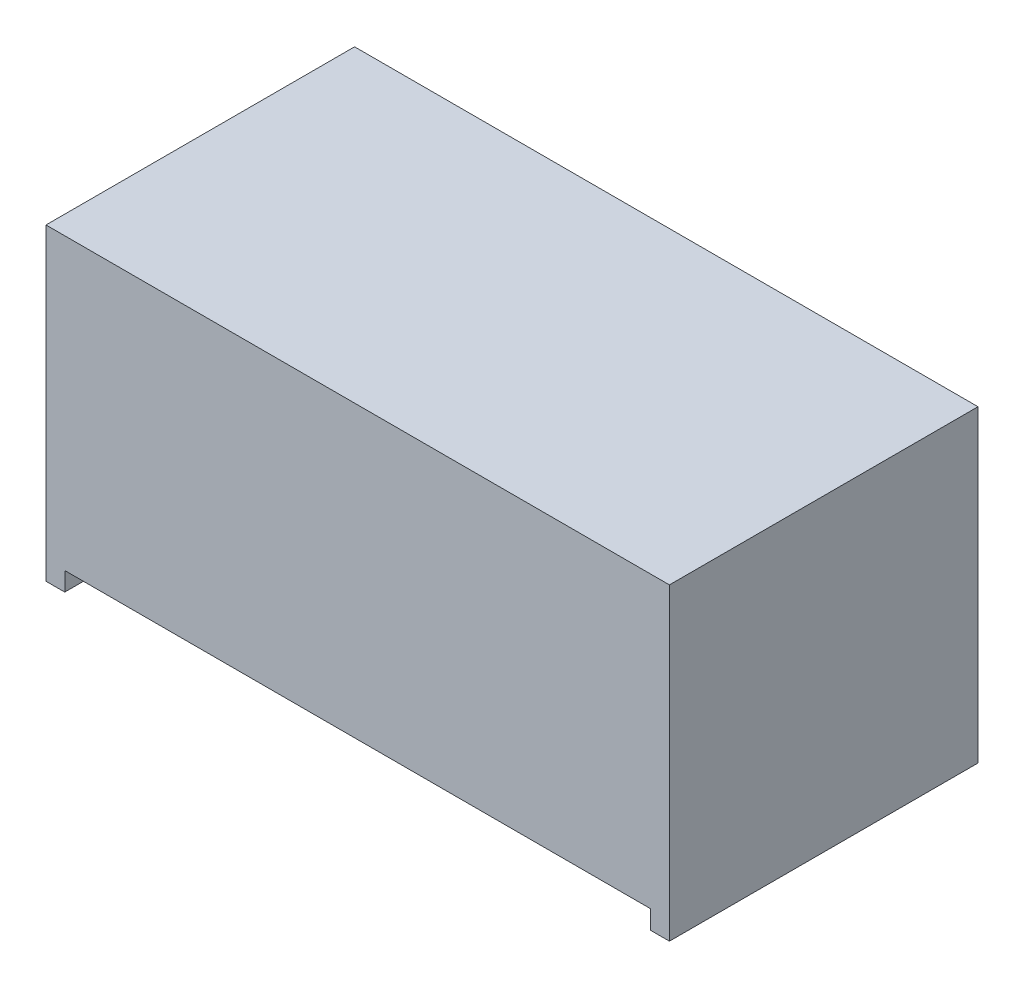
ISO-10303-21;
HEADER;
FILE_DESCRIPTION(('STEP AP214'),'2;1');
FILE_NAME('part.step','',(''),(''),'','','');
FILE_SCHEMA(('AUTOMOTIVE_DESIGN { 1 0 10303 214 1 1 1 1 }'));
ENDSEC;
DATA;
#1=APPLICATION_CONTEXT('core data for automotive mechanical design processes');
#2=APPLICATION_PROTOCOL_DEFINITION('international standard','automotive_design',2000,#1);
#3=PRODUCT_CONTEXT('',#1,'mechanical');
#4=PRODUCT('Part','Part','',(#3));
#5=PRODUCT_RELATED_PRODUCT_CATEGORY('part','',(#4));
#6=PRODUCT_DEFINITION_FORMATION('','',#4);
#7=PRODUCT_DEFINITION_CONTEXT('part definition',#1,'design');
#8=PRODUCT_DEFINITION('design','',#6,#7);
#9=PRODUCT_DEFINITION_SHAPE('','',#8);
#10=(LENGTH_UNIT() NAMED_UNIT(*) SI_UNIT(.MILLI.,.METRE.));
#11=(NAMED_UNIT(*) PLANE_ANGLE_UNIT() SI_UNIT($,.RADIAN.));
#12=(NAMED_UNIT(*) SI_UNIT($,.STERADIAN.) SOLID_ANGLE_UNIT());
#13=UNCERTAINTY_MEASURE_WITH_UNIT(LENGTH_MEASURE(1.E-05),#10,'distance_accuracy_value','');
#14=(GEOMETRIC_REPRESENTATION_CONTEXT(3) GLOBAL_UNCERTAINTY_ASSIGNED_CONTEXT((#13)) GLOBAL_UNIT_ASSIGNED_CONTEXT((#10,
#11,#12)) REPRESENTATION_CONTEXT('',''));
#15=CARTESIAN_POINT('',(0.,0.,0.));
#16=DIRECTION('',(0.,0.,1.));
#17=DIRECTION('',(1.,0.,0.));
#18=AXIS2_PLACEMENT_3D('',#15,#16,#17);
#19=CARTESIAN_POINT('',(10.,0.,4.95));
#20=DIRECTION('',(0.,1.,0.));
#21=DIRECTION('',(0.,0.,1.));
#22=AXIS2_PLACEMENT_3D('',#19,#20,#21);
#23=PLANE('',#22);
#24=DIRECTION('',(0.,0.,-1.));
#25=VECTOR('',#24,1.);
#26=CARTESIAN_POINT('',(9.39831035914173,0.,4.95));
#27=LINE('',#26,#25);
#28=CARTESIAN_POINT('',(9.39831035914173,0.,4.95));
#29=VERTEX_POINT('',#28);
#30=CARTESIAN_POINT('',(9.39831035914173,0.,-4.95));
#31=VERTEX_POINT('',#30);
#32=EDGE_CURVE('E121',#29,#31,#27,.T.);
#33=ORIENTED_EDGE('',*,*,#32,.F.);
#34=DIRECTION('',(1.,0.,0.));
#35=VECTOR('',#34,1.);
#36=CARTESIAN_POINT('',(-10.,0.,4.95));
#37=LINE('',#36,#35);
#38=CARTESIAN_POINT('',(-9.39831035914173,0.,4.95));
#39=VERTEX_POINT('',#38);
#40=EDGE_CURVE('E149',#39,#29,#37,.T.);
#41=ORIENTED_EDGE('',*,*,#40,.F.);
#42=DIRECTION('',(0.,0.,1.));
#43=VECTOR('',#42,1.);
#44=CARTESIAN_POINT('',(-9.39831035914173,0.,4.95));
#45=LINE('',#44,#43);
#46=CARTESIAN_POINT('',(-9.39831035914173,0.,-4.95));
#47=VERTEX_POINT('',#46);
#48=EDGE_CURVE('E130',#47,#39,#45,.T.);
#49=ORIENTED_EDGE('',*,*,#48,.F.);
#50=DIRECTION('',(-1.,0.,0.));
#51=VECTOR('',#50,1.);
#52=CARTESIAN_POINT('',(-10.,0.,-4.95));
#53=LINE('',#52,#51);
#54=EDGE_CURVE('E34',#31,#47,#53,.T.);
#55=ORIENTED_EDGE('',*,*,#54,.F.);
#56=EDGE_LOOP('',(#33,#41,#49,#55));
#57=FACE_BOUND('',#56,.T.);
#58=ADVANCED_FACE('F30',(#57),#23,.F.);
#59=CARTESIAN_POINT('',(10.,9.3,-4.95));
#60=DIRECTION('',(-1.,0.,0.));
#61=DIRECTION('',(0.,0.,1.));
#62=AXIS2_PLACEMENT_3D('',#59,#60,#61);
#63=PLANE('',#62);
#64=DIRECTION('',(0.,-1.,0.));
#65=VECTOR('',#64,1.);
#66=CARTESIAN_POINT('',(10.,9.3,4.95));
#67=LINE('',#66,#65);
#68=CARTESIAN_POINT('',(10.,9.3,4.95));
#69=VERTEX_POINT('',#68);
#70=CARTESIAN_POINT('',(10.,-0.6,4.95));
#71=VERTEX_POINT('',#70);
#72=EDGE_CURVE('E99',#69,#71,#67,.T.);
#73=ORIENTED_EDGE('',*,*,#72,.T.);
#74=DIRECTION('',(0.,0.,1.));
#75=VECTOR('',#74,1.);
#76=CARTESIAN_POINT('',(10.,-0.6,4.95));
#77=LINE('',#76,#75);
#78=CARTESIAN_POINT('',(10.,-0.6,-4.95));
#79=VERTEX_POINT('',#78);
#80=EDGE_CURVE('E103',#79,#71,#77,.T.);
#81=ORIENTED_EDGE('',*,*,#80,.F.);
#82=DIRECTION('',(0.,-1.,0.));
#83=VECTOR('',#82,1.);
#84=CARTESIAN_POINT('',(10.,9.3,-4.95));
#85=LINE('',#84,#83);
#86=CARTESIAN_POINT('',(10.,9.3,-4.95));
#87=VERTEX_POINT('',#86);
#88=EDGE_CURVE('E11',#87,#79,#85,.T.);
#89=ORIENTED_EDGE('',*,*,#88,.F.);
#90=DIRECTION('',(0.,0.,-1.));
#91=VECTOR('',#90,1.);
#92=CARTESIAN_POINT('',(10.,9.3,-4.95));
#93=LINE('',#92,#91);
#94=EDGE_CURVE('E104',#69,#87,#93,.T.);
#95=ORIENTED_EDGE('',*,*,#94,.F.);
#96=EDGE_LOOP('',(#73,#81,#89,#95));
#97=FACE_BOUND('',#96,.T.);
#98=ADVANCED_FACE('F32',(#97),#63,.F.);
#99=CARTESIAN_POINT('',(-10.,9.3,-4.95));
#100=DIRECTION('',(0.,0.,1.));
#101=DIRECTION('',(1.,0.,0.));
#102=AXIS2_PLACEMENT_3D('',#99,#100,#101);
#103=PLANE('',#102);
#104=ORIENTED_EDGE('',*,*,#88,.T.);
#105=DIRECTION('',(1.,0.,0.));
#106=VECTOR('',#105,1.);
#107=CARTESIAN_POINT('',(10.,-0.6,-4.95));
#108=LINE('',#107,#106);
#109=CARTESIAN_POINT('',(9.39831035914173,-0.6,-4.95));
#110=VERTEX_POINT('',#109);
#111=EDGE_CURVE('E120',#110,#79,#108,.T.);
#112=ORIENTED_EDGE('',*,*,#111,.F.);
#113=DIRECTION('',(0.,1.,0.));
#114=VECTOR('',#113,1.);
#115=CARTESIAN_POINT('',(9.39831035914173,-0.6,-4.95));
#116=LINE('',#115,#114);
#117=EDGE_CURVE('E126',#110,#31,#116,.T.);
#118=ORIENTED_EDGE('',*,*,#117,.T.);
#119=ORIENTED_EDGE('',*,*,#54,.T.);
#120=DIRECTION('',(0.,1.,0.));
#121=VECTOR('',#120,1.);
#122=CARTESIAN_POINT('',(-9.39831035914173,-0.6,-4.95));
#123=LINE('',#122,#121);
#124=CARTESIAN_POINT('',(-9.39831035914173,-0.6,-4.95));
#125=VERTEX_POINT('',#124);
#126=EDGE_CURVE('E153',#125,#47,#123,.T.);
#127=ORIENTED_EDGE('',*,*,#126,.F.);
#128=DIRECTION('',(1.,0.,0.));
#129=VECTOR('',#128,1.);
#130=CARTESIAN_POINT('',(-10.,-0.6,-4.95));
#131=LINE('',#130,#129);
#132=CARTESIAN_POINT('',(-10.,-0.6,-4.95));
#133=VERTEX_POINT('',#132);
#134=EDGE_CURVE('E134',#133,#125,#131,.T.);
#135=ORIENTED_EDGE('',*,*,#134,.F.);
#136=DIRECTION('',(0.,-1.,0.));
#137=VECTOR('',#136,1.);
#138=CARTESIAN_POINT('',(-10.,9.3,-4.95));
#139=LINE('',#138,#137);
#140=CARTESIAN_POINT('',(-10.,9.3,-4.95));
#141=VERTEX_POINT('',#140);
#142=EDGE_CURVE('E40',#141,#133,#139,.T.);
#143=ORIENTED_EDGE('',*,*,#142,.F.);
#144=DIRECTION('',(-1.,0.,0.));
#145=VECTOR('',#144,1.);
#146=CARTESIAN_POINT('',(-10.,9.3,-4.95));
#147=LINE('',#146,#145);
#148=EDGE_CURVE('E160',#87,#141,#147,.T.);
#149=ORIENTED_EDGE('',*,*,#148,.F.);
#150=EDGE_LOOP('',(#104,#112,#118,#119,#127,#135,#143,#149));
#151=FACE_BOUND('',#150,.T.);
#152=ADVANCED_FACE('F175',(#151),#103,.F.);
#153=CARTESIAN_POINT('',(-10.,9.3,-4.95));
#154=DIRECTION('',(1.,0.,0.));
#155=DIRECTION('',(0.,0.,-1.));
#156=AXIS2_PLACEMENT_3D('',#153,#154,#155);
#157=PLANE('',#156);
#158=ORIENTED_EDGE('',*,*,#142,.T.);
#159=DIRECTION('',(0.,0.,-1.));
#160=VECTOR('',#159,1.);
#161=CARTESIAN_POINT('',(-10.,-0.6,4.95));
#162=LINE('',#161,#160);
#163=CARTESIAN_POINT('',(-10.,-0.6,4.95));
#164=VERTEX_POINT('',#163);
#165=EDGE_CURVE('E131',#164,#133,#162,.T.);
#166=ORIENTED_EDGE('',*,*,#165,.F.);
#167=DIRECTION('',(0.,-1.,0.));
#168=VECTOR('',#167,1.);
#169=CARTESIAN_POINT('',(-10.,9.3,4.95));
#170=LINE('',#169,#168);
#171=CARTESIAN_POINT('',(-10.,9.3,4.95));
#172=VERTEX_POINT('',#171);
#173=EDGE_CURVE('E106',#172,#164,#170,.T.);
#174=ORIENTED_EDGE('',*,*,#173,.F.);
#175=DIRECTION('',(0.,0.,1.));
#176=VECTOR('',#175,1.);
#177=CARTESIAN_POINT('',(-10.,9.3,-4.95));
#178=LINE('',#177,#176);
#179=EDGE_CURVE('E161',#141,#172,#178,.T.);
#180=ORIENTED_EDGE('',*,*,#179,.F.);
#181=EDGE_LOOP('',(#158,#166,#174,#180));
#182=FACE_BOUND('',#181,.T.);
#183=ADVANCED_FACE('F173',(#182),#157,.F.);
#184=CARTESIAN_POINT('',(-10.,9.3,4.95));
#185=DIRECTION('',(0.,0.,-1.));
#186=DIRECTION('',(-1.,0.,0.));
#187=AXIS2_PLACEMENT_3D('',#184,#185,#186);
#188=PLANE('',#187);
#189=ORIENTED_EDGE('',*,*,#173,.T.);
#190=DIRECTION('',(-1.,0.,0.));
#191=VECTOR('',#190,1.);
#192=CARTESIAN_POINT('',(-10.,-0.6,4.95));
#193=LINE('',#192,#191);
#194=CARTESIAN_POINT('',(-9.39831035914173,-0.6,4.95));
#195=VERTEX_POINT('',#194);
#196=EDGE_CURVE('E138',#195,#164,#193,.T.);
#197=ORIENTED_EDGE('',*,*,#196,.F.);
#198=DIRECTION('',(0.,1.,0.));
#199=VECTOR('',#198,1.);
#200=CARTESIAN_POINT('',(-9.39831035914173,-0.6,4.95));
#201=LINE('',#200,#199);
#202=EDGE_CURVE('E141',#195,#39,#201,.T.);
#203=ORIENTED_EDGE('',*,*,#202,.T.);
#204=ORIENTED_EDGE('',*,*,#40,.T.);
#205=DIRECTION('',(0.,1.,0.));
#206=VECTOR('',#205,1.);
#207=CARTESIAN_POINT('',(9.39831035914173,-0.6,4.95));
#208=LINE('',#207,#206);
#209=CARTESIAN_POINT('',(9.39831035914173,-0.6,4.95));
#210=VERTEX_POINT('',#209);
#211=EDGE_CURVE('E112',#210,#29,#208,.T.);
#212=ORIENTED_EDGE('',*,*,#211,.F.);
#213=DIRECTION('',(-1.,0.,0.));
#214=VECTOR('',#213,1.);
#215=CARTESIAN_POINT('',(10.,-0.6,4.95));
#216=LINE('',#215,#214);
#217=EDGE_CURVE('E109',#71,#210,#216,.T.);
#218=ORIENTED_EDGE('',*,*,#217,.F.);
#219=ORIENTED_EDGE('',*,*,#72,.F.);
#220=DIRECTION('',(1.,0.,0.));
#221=VECTOR('',#220,1.);
#222=CARTESIAN_POINT('',(-10.,9.3,4.95));
#223=LINE('',#222,#221);
#224=EDGE_CURVE('E55',#172,#69,#223,.T.);
#225=ORIENTED_EDGE('',*,*,#224,.F.);
#226=EDGE_LOOP('',(#189,#197,#203,#204,#212,#218,#219,#225));
#227=FACE_BOUND('',#226,.T.);
#228=ADVANCED_FACE('F110',(#227),#188,.F.);
#229=CARTESIAN_POINT('',(10.,9.3,4.95));
#230=DIRECTION('',(0.,1.,0.));
#231=DIRECTION('',(0.,0.,1.));
#232=AXIS2_PLACEMENT_3D('',#229,#230,#231);
#233=PLANE('',#232);
#234=ORIENTED_EDGE('',*,*,#94,.T.);
#235=ORIENTED_EDGE('',*,*,#148,.T.);
#236=ORIENTED_EDGE('',*,*,#179,.T.);
#237=ORIENTED_EDGE('',*,*,#224,.T.);
#238=EDGE_LOOP('',(#234,#235,#236,#237));
#239=FACE_BOUND('',#238,.T.);
#240=ADVANCED_FACE('F201',(#239),#233,.T.);
#241=CARTESIAN_POINT('',(-9.39831035914173,-0.6,4.95));
#242=DIRECTION('',(-1.,0.,0.));
#243=DIRECTION('',(0.,0.,1.));
#244=AXIS2_PLACEMENT_3D('',#241,#242,#243);
#245=PLANE('',#244);
#246=ORIENTED_EDGE('',*,*,#48,.T.);
#247=ORIENTED_EDGE('',*,*,#202,.F.);
#248=DIRECTION('',(0.,0.,1.));
#249=VECTOR('',#248,1.);
#250=CARTESIAN_POINT('',(-9.39831035914173,-0.6,4.95));
#251=LINE('',#250,#249);
#252=EDGE_CURVE('E136',#125,#195,#251,.T.);
#253=ORIENTED_EDGE('',*,*,#252,.F.);
#254=ORIENTED_EDGE('',*,*,#126,.T.);
#255=EDGE_LOOP('',(#246,#247,#253,#254));
#256=FACE_BOUND('',#255,.T.);
#257=ADVANCED_FACE('F180',(#256),#245,.F.);
#258=CARTESIAN_POINT('',(-10.,-0.6,-4.95));
#259=DIRECTION('',(0.,-1.,0.));
#260=DIRECTION('',(0.,0.,-1.));
#261=AXIS2_PLACEMENT_3D('',#258,#259,#260);
#262=PLANE('',#261);
#263=ORIENTED_EDGE('',*,*,#165,.T.);
#264=ORIENTED_EDGE('',*,*,#134,.T.);
#265=ORIENTED_EDGE('',*,*,#252,.T.);
#266=ORIENTED_EDGE('',*,*,#196,.T.);
#267=EDGE_LOOP('',(#263,#264,#265,#266));
#268=FACE_BOUND('',#267,.T.);
#269=ADVANCED_FACE('F177',(#268),#262,.T.);
#270=CARTESIAN_POINT('',(9.39831035914173,-0.6,4.95));
#271=DIRECTION('',(1.,0.,0.));
#272=DIRECTION('',(0.,0.,-1.));
#273=AXIS2_PLACEMENT_3D('',#270,#271,#272);
#274=PLANE('',#273);
#275=ORIENTED_EDGE('',*,*,#32,.T.);
#276=ORIENTED_EDGE('',*,*,#117,.F.);
#277=DIRECTION('',(0.,0.,-1.));
#278=VECTOR('',#277,1.);
#279=CARTESIAN_POINT('',(9.39831035914173,-0.6,4.95));
#280=LINE('',#279,#278);
#281=EDGE_CURVE('E115',#210,#110,#280,.T.);
#282=ORIENTED_EDGE('',*,*,#281,.F.);
#283=ORIENTED_EDGE('',*,*,#211,.T.);
#284=EDGE_LOOP('',(#275,#276,#282,#283));
#285=FACE_BOUND('',#284,.T.);
#286=ADVANCED_FACE('F185',(#285),#274,.F.);
#287=CARTESIAN_POINT('',(10.,-0.6,-4.95));
#288=DIRECTION('',(0.,1.,0.));
#289=DIRECTION('',(0.,0.,1.));
#290=AXIS2_PLACEMENT_3D('',#287,#288,#289);
#291=PLANE('',#290);
#292=ORIENTED_EDGE('',*,*,#80,.T.);
#293=ORIENTED_EDGE('',*,*,#217,.T.);
#294=ORIENTED_EDGE('',*,*,#281,.T.);
#295=ORIENTED_EDGE('',*,*,#111,.T.);
#296=EDGE_LOOP('',(#292,#293,#294,#295));
#297=FACE_BOUND('',#296,.T.);
#298=ADVANCED_FACE('F118',(#297),#291,.F.);
#299=CLOSED_SHELL('',(#58,#98,#152,#183,#228,#240,#257,#269,#286,#298));
#300=MANIFOLD_SOLID_BREP('B2',#299);
#301=ADVANCED_BREP_SHAPE_REPRESENTATION('',(#18,#300),#14);
#302=SHAPE_DEFINITION_REPRESENTATION(#9,#301);
ENDSEC;
END-ISO-10303-21;
